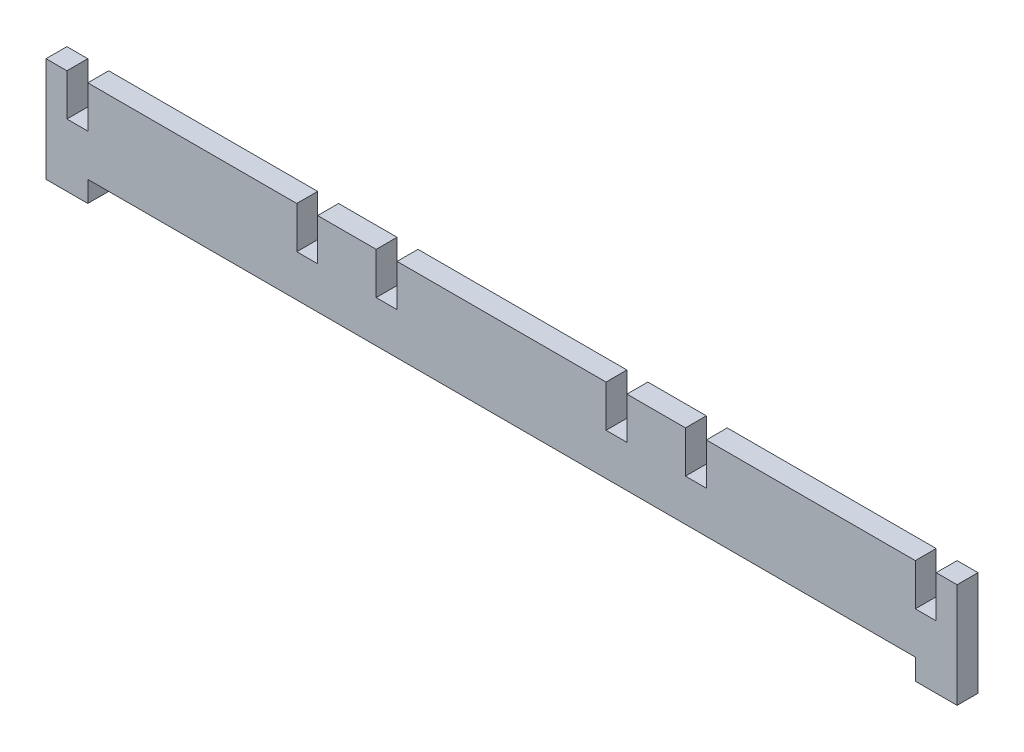
ISO-10303-21;
HEADER;
FILE_DESCRIPTION(('STEP AP214'),'2;1');
FILE_NAME('part.step','',(''),(''),'','','');
FILE_SCHEMA(('AUTOMOTIVE_DESIGN { 1 0 10303 214 1 1 1 1 }'));
ENDSEC;
DATA;
#1=APPLICATION_CONTEXT('core data for automotive mechanical design processes');
#2=APPLICATION_PROTOCOL_DEFINITION('international standard','automotive_design',2000,#1);
#3=PRODUCT_CONTEXT('',#1,'mechanical');
#4=PRODUCT('Part','Part','',(#3));
#5=PRODUCT_RELATED_PRODUCT_CATEGORY('part','',(#4));
#6=PRODUCT_DEFINITION_FORMATION('','',#4);
#7=PRODUCT_DEFINITION_CONTEXT('part definition',#1,'design');
#8=PRODUCT_DEFINITION('design','',#6,#7);
#9=PRODUCT_DEFINITION_SHAPE('','',#8);
#10=(LENGTH_UNIT() NAMED_UNIT(*) SI_UNIT(.MILLI.,.METRE.));
#11=(NAMED_UNIT(*) PLANE_ANGLE_UNIT() SI_UNIT($,.RADIAN.));
#12=(NAMED_UNIT(*) SI_UNIT($,.STERADIAN.) SOLID_ANGLE_UNIT());
#13=UNCERTAINTY_MEASURE_WITH_UNIT(LENGTH_MEASURE(1.E-05),#10,'distance_accuracy_value','');
#14=(GEOMETRIC_REPRESENTATION_CONTEXT(3) GLOBAL_UNCERTAINTY_ASSIGNED_CONTEXT((#13)) GLOBAL_UNIT_ASSIGNED_CONTEXT((#10,
#11,#12)) REPRESENTATION_CONTEXT('',''));
#15=CARTESIAN_POINT('',(0.,0.,0.));
#16=DIRECTION('',(0.,0.,1.));
#17=DIRECTION('',(1.,0.,0.));
#18=AXIS2_PLACEMENT_3D('',#15,#16,#17);
#19=CARTESIAN_POINT('',(-44.,-5.1679065461745E-13,5.));
#20=DIRECTION('',(0.,-1.,0.));
#21=DIRECTION('',(1.,0.,0.));
#22=AXIS2_PLACEMENT_3D('',#19,#20,#21);
#23=PLANE('',#22);
#24=DIRECTION('',(-1.,0.,0.));
#25=VECTOR('',#24,1.);
#26=CARTESIAN_POINT('',(-44.,-5.1679065461745E-13,0.));
#27=LINE('',#26,#25);
#28=CARTESIAN_POINT('',(-30.,0.,0.));
#29=VERTEX_POINT('',#28);
#30=CARTESIAN_POINT('',(-44.,-5.1679065461745E-13,0.));
#31=VERTEX_POINT('',#30);
#32=EDGE_CURVE('E279',#29,#31,#27,.T.);
#33=ORIENTED_EDGE('',*,*,#32,.T.);
#34=DIRECTION('',(0.,0.,-1.));
#35=VECTOR('',#34,1.);
#36=CARTESIAN_POINT('',(-44.,-5.1679065461745E-13,5.));
#37=LINE('',#36,#35);
#38=CARTESIAN_POINT('',(-44.,-5.1679065461745E-13,5.));
#39=VERTEX_POINT('',#38);
#40=EDGE_CURVE('E11',#39,#31,#37,.T.);
#41=ORIENTED_EDGE('',*,*,#40,.F.);
#42=DIRECTION('',(-1.,0.,0.));
#43=VECTOR('',#42,1.);
#44=CARTESIAN_POINT('',(-44.,-5.1679065461745E-13,5.));
#45=LINE('',#44,#43);
#46=CARTESIAN_POINT('',(-30.,0.,5.));
#47=VERTEX_POINT('',#46);
#48=EDGE_CURVE('E341',#47,#39,#45,.T.);
#49=ORIENTED_EDGE('',*,*,#48,.F.);
#50=DIRECTION('',(0.,0.,-1.));
#51=VECTOR('',#50,1.);
#52=CARTESIAN_POINT('',(-30.,0.,5.));
#53=LINE('',#52,#51);
#54=EDGE_CURVE('E275',#47,#29,#53,.T.);
#55=ORIENTED_EDGE('',*,*,#54,.T.);
#56=EDGE_LOOP('',(#33,#41,#49,#55));
#57=FACE_BOUND('',#56,.T.);
#58=ADVANCED_FACE('F39',(#57),#23,.F.);
#59=CARTESIAN_POINT('',(-44.,-5.1679065461745E-13,5.));
#60=DIRECTION('',(1.,0.,0.));
#61=DIRECTION('',(0.,0.,-1.));
#62=AXIS2_PLACEMENT_3D('',#59,#60,#61);
#63=PLANE('',#62);
#64=DIRECTION('',(0.,-1.,0.));
#65=VECTOR('',#64,1.);
#66=CARTESIAN_POINT('',(-44.,-5.1679065461745E-13,0.));
#67=LINE('',#66,#65);
#68=CARTESIAN_POINT('',(-44.,-10.0000000000005,0.));
#69=VERTEX_POINT('',#68);
#70=EDGE_CURVE('E282',#31,#69,#67,.T.);
#71=ORIENTED_EDGE('',*,*,#70,.T.);
#72=DIRECTION('',(0.,0.,-1.));
#73=VECTOR('',#72,1.);
#74=CARTESIAN_POINT('',(-44.,-10.0000000000005,5.));
#75=LINE('',#74,#73);
#76=CARTESIAN_POINT('',(-44.,-10.0000000000005,5.));
#77=VERTEX_POINT('',#76);
#78=EDGE_CURVE('E47',#77,#69,#75,.T.);
#79=ORIENTED_EDGE('',*,*,#78,.F.);
#80=DIRECTION('',(0.,-1.,0.));
#81=VECTOR('',#80,1.);
#82=CARTESIAN_POINT('',(-44.,-5.1679065461745E-13,5.));
#83=LINE('',#82,#81);
#84=EDGE_CURVE('E170',#39,#77,#83,.T.);
#85=ORIENTED_EDGE('',*,*,#84,.F.);
#86=ORIENTED_EDGE('',*,*,#40,.T.);
#87=EDGE_LOOP('',(#71,#79,#85,#86));
#88=FACE_BOUND('',#87,.T.);
#89=ADVANCED_FACE('F519',(#88),#63,.F.);
#90=CARTESIAN_POINT('',(-44.,-10.0000000000005,5.));
#91=DIRECTION('',(0.,-1.,0.));
#92=DIRECTION('',(0.,0.,-1.));
#93=AXIS2_PLACEMENT_3D('',#90,#91,#92);
#94=PLANE('',#93);
#95=DIRECTION('',(-1.,0.,0.));
#96=VECTOR('',#95,1.);
#97=CARTESIAN_POINT('',(-44.,-10.0000000000005,0.));
#98=LINE('',#97,#96);
#99=CARTESIAN_POINT('',(-49.,-10.0000000000005,0.));
#100=VERTEX_POINT('',#99);
#101=EDGE_CURVE('E284',#69,#100,#98,.T.);
#102=ORIENTED_EDGE('',*,*,#101,.T.);
#103=DIRECTION('',(0.,0.,-1.));
#104=VECTOR('',#103,1.);
#105=CARTESIAN_POINT('',(-49.,-10.0000000000005,5.));
#106=LINE('',#105,#104);
#107=CARTESIAN_POINT('',(-49.,-10.0000000000005,5.));
#108=VERTEX_POINT('',#107);
#109=EDGE_CURVE('E420',#108,#100,#106,.T.);
#110=ORIENTED_EDGE('',*,*,#109,.F.);
#111=DIRECTION('',(-1.,0.,0.));
#112=VECTOR('',#111,1.);
#113=CARTESIAN_POINT('',(-44.,-10.0000000000005,5.));
#114=LINE('',#113,#112);
#115=EDGE_CURVE('E428',#77,#108,#114,.T.);
#116=ORIENTED_EDGE('',*,*,#115,.F.);
#117=ORIENTED_EDGE('',*,*,#78,.T.);
#118=EDGE_LOOP('',(#102,#110,#116,#117));
#119=FACE_BOUND('',#118,.T.);
#120=ADVANCED_FACE('F426',(#119),#94,.F.);
#121=CARTESIAN_POINT('',(-49.,-10.0000000000005,5.));
#122=DIRECTION('',(-1.,0.,0.));
#123=DIRECTION('',(0.,-1.,0.));
#124=AXIS2_PLACEMENT_3D('',#121,#122,#123);
#125=PLANE('',#124);
#126=DIRECTION('',(0.,1.,0.));
#127=VECTOR('',#126,1.);
#128=CARTESIAN_POINT('',(-49.,-10.0000000000005,0.));
#129=LINE('',#128,#127);
#130=CARTESIAN_POINT('',(-49.,-5.10616004153047E-13,0.));
#131=VERTEX_POINT('',#130);
#132=EDGE_CURVE('E286',#100,#131,#129,.T.);
#133=ORIENTED_EDGE('',*,*,#132,.T.);
#134=DIRECTION('',(0.,0.,-1.));
#135=VECTOR('',#134,1.);
#136=CARTESIAN_POINT('',(-49.,-5.10616004153047E-13,5.));
#137=LINE('',#136,#135);
#138=CARTESIAN_POINT('',(-49.,-5.10616004153047E-13,5.));
#139=VERTEX_POINT('',#138);
#140=EDGE_CURVE('E417',#139,#131,#137,.T.);
#141=ORIENTED_EDGE('',*,*,#140,.F.);
#142=DIRECTION('',(0.,1.,0.));
#143=VECTOR('',#142,1.);
#144=CARTESIAN_POINT('',(-49.,-10.0000000000005,5.));
#145=LINE('',#144,#143);
#146=EDGE_CURVE('E446',#108,#139,#145,.T.);
#147=ORIENTED_EDGE('',*,*,#146,.F.);
#148=ORIENTED_EDGE('',*,*,#109,.T.);
#149=EDGE_LOOP('',(#133,#141,#147,#148));
#150=FACE_BOUND('',#149,.T.);
#151=ADVANCED_FACE('F437',(#150),#125,.F.);
#152=CARTESIAN_POINT('',(-99.,-5.16739238148784E-13,5.));
#153=DIRECTION('',(0.,-1.,0.));
#154=DIRECTION('',(1.,0.,0.));
#155=AXIS2_PLACEMENT_3D('',#152,#153,#154);
#156=PLANE('',#155);
#157=DIRECTION('',(-1.,0.,0.));
#158=VECTOR('',#157,1.);
#159=CARTESIAN_POINT('',(-99.,-5.16739238148784E-13,0.));
#160=LINE('',#159,#158);
#161=CARTESIAN_POINT('',(-99.,-5.16739238148784E-13,0.));
#162=VERTEX_POINT('',#161);
#163=EDGE_CURVE('E288',#131,#162,#160,.T.);
#164=ORIENTED_EDGE('',*,*,#163,.T.);
#165=DIRECTION('',(0.,0.,-1.));
#166=VECTOR('',#165,1.);
#167=CARTESIAN_POINT('',(-99.,-5.16739238148784E-13,5.));
#168=LINE('',#167,#166);
#169=CARTESIAN_POINT('',(-99.,-5.16739238148784E-13,5.));
#170=VERTEX_POINT('',#169);
#171=EDGE_CURVE('E414',#170,#162,#168,.T.);
#172=ORIENTED_EDGE('',*,*,#171,.F.);
#173=DIRECTION('',(-1.,0.,0.));
#174=VECTOR('',#173,1.);
#175=CARTESIAN_POINT('',(-99.,-5.16739238148784E-13,5.));
#176=LINE('',#175,#174);
#177=EDGE_CURVE('E443',#139,#170,#176,.T.);
#178=ORIENTED_EDGE('',*,*,#177,.F.);
#179=ORIENTED_EDGE('',*,*,#140,.T.);
#180=EDGE_LOOP('',(#164,#172,#178,#179));
#181=FACE_BOUND('',#180,.T.);
#182=ADVANCED_FACE('F441',(#181),#156,.F.);
#183=CARTESIAN_POINT('',(-99.,-10.0000000000005,5.));
#184=DIRECTION('',(1.,0.,0.));
#185=DIRECTION('',(0.,0.,-1.));
#186=AXIS2_PLACEMENT_3D('',#183,#184,#185);
#187=PLANE('',#186);
#188=DIRECTION('',(0.,-1.,0.));
#189=VECTOR('',#188,1.);
#190=CARTESIAN_POINT('',(-99.,-10.0000000000005,0.));
#191=LINE('',#190,#189);
#192=CARTESIAN_POINT('',(-99.,-10.0000000000005,0.));
#193=VERTEX_POINT('',#192);
#194=EDGE_CURVE('E290',#162,#193,#191,.T.);
#195=ORIENTED_EDGE('',*,*,#194,.T.);
#196=DIRECTION('',(0.,0.,-1.));
#197=VECTOR('',#196,1.);
#198=CARTESIAN_POINT('',(-99.,-10.0000000000005,5.));
#199=LINE('',#198,#197);
#200=CARTESIAN_POINT('',(-99.,-10.0000000000005,5.));
#201=VERTEX_POINT('',#200);
#202=EDGE_CURVE('E411',#201,#193,#199,.T.);
#203=ORIENTED_EDGE('',*,*,#202,.F.);
#204=DIRECTION('',(0.,-1.,0.));
#205=VECTOR('',#204,1.);
#206=CARTESIAN_POINT('',(-99.,-10.0000000000005,5.));
#207=LINE('',#206,#205);
#208=EDGE_CURVE('E445',#170,#201,#207,.T.);
#209=ORIENTED_EDGE('',*,*,#208,.F.);
#210=ORIENTED_EDGE('',*,*,#171,.T.);
#211=EDGE_LOOP('',(#195,#203,#209,#210));
#212=FACE_BOUND('',#211,.T.);
#213=ADVANCED_FACE('F532',(#212),#187,.F.);
#214=CARTESIAN_POINT('',(-104.,-10.0000000000005,5.));
#215=DIRECTION('',(0.,-1.,0.));
#216=DIRECTION('',(0.,0.,-1.));
#217=AXIS2_PLACEMENT_3D('',#214,#215,#216);
#218=PLANE('',#217);
#219=DIRECTION('',(-1.,0.,0.));
#220=VECTOR('',#219,1.);
#221=CARTESIAN_POINT('',(-104.,-10.0000000000005,0.));
#222=LINE('',#221,#220);
#223=CARTESIAN_POINT('',(-104.,-10.0000000000005,0.));
#224=VERTEX_POINT('',#223);
#225=EDGE_CURVE('E292',#193,#224,#222,.T.);
#226=ORIENTED_EDGE('',*,*,#225,.T.);
#227=DIRECTION('',(0.,0.,-1.));
#228=VECTOR('',#227,1.);
#229=CARTESIAN_POINT('',(-104.,-10.0000000000005,5.));
#230=LINE('',#229,#228);
#231=CARTESIAN_POINT('',(-104.,-10.0000000000005,5.));
#232=VERTEX_POINT('',#231);
#233=EDGE_CURVE('E408',#232,#224,#230,.T.);
#234=ORIENTED_EDGE('',*,*,#233,.F.);
#235=DIRECTION('',(-1.,0.,0.));
#236=VECTOR('',#235,1.);
#237=CARTESIAN_POINT('',(-104.,-10.0000000000005,5.));
#238=LINE('',#237,#236);
#239=EDGE_CURVE('E448',#201,#232,#238,.T.);
#240=ORIENTED_EDGE('',*,*,#239,.F.);
#241=ORIENTED_EDGE('',*,*,#202,.T.);
#242=EDGE_LOOP('',(#226,#234,#240,#241));
#243=FACE_BOUND('',#242,.T.);
#244=ADVANCED_FACE('F535',(#243),#218,.F.);
#245=CARTESIAN_POINT('',(-104.,0.,5.));
#246=DIRECTION('',(-1.,0.,0.));
#247=DIRECTION('',(0.,0.,1.));
#248=AXIS2_PLACEMENT_3D('',#245,#246,#247);
#249=PLANE('',#248);
#250=DIRECTION('',(0.,1.,0.));
#251=VECTOR('',#250,1.);
#252=CARTESIAN_POINT('',(-104.,0.,0.));
#253=LINE('',#252,#251);
#254=CARTESIAN_POINT('',(-104.,0.,0.));
#255=VERTEX_POINT('',#254);
#256=EDGE_CURVE('E294',#224,#255,#253,.T.);
#257=ORIENTED_EDGE('',*,*,#256,.T.);
#258=DIRECTION('',(0.,0.,-1.));
#259=VECTOR('',#258,1.);
#260=CARTESIAN_POINT('',(-104.,0.,5.));
#261=LINE('',#260,#259);
#262=CARTESIAN_POINT('',(-104.,0.,5.));
#263=VERTEX_POINT('',#262);
#264=EDGE_CURVE('E405',#263,#255,#261,.T.);
#265=ORIENTED_EDGE('',*,*,#264,.F.);
#266=DIRECTION('',(0.,1.,0.));
#267=VECTOR('',#266,1.);
#268=CARTESIAN_POINT('',(-104.,0.,5.));
#269=LINE('',#268,#267);
#270=EDGE_CURVE('E454',#232,#263,#269,.T.);
#271=ORIENTED_EDGE('',*,*,#270,.F.);
#272=ORIENTED_EDGE('',*,*,#233,.T.);
#273=EDGE_LOOP('',(#257,#265,#271,#272));
#274=FACE_BOUND('',#273,.T.);
#275=ADVANCED_FACE('F539',(#274),#249,.F.);
#276=CARTESIAN_POINT('',(-109.,0.,5.));
#277=DIRECTION('',(0.,-1.,0.));
#278=DIRECTION('',(0.,0.,-1.));
#279=AXIS2_PLACEMENT_3D('',#276,#277,#278);
#280=PLANE('',#279);
#281=DIRECTION('',(-1.,0.,0.));
#282=VECTOR('',#281,1.);
#283=CARTESIAN_POINT('',(-109.,0.,0.));
#284=LINE('',#283,#282);
#285=CARTESIAN_POINT('',(-109.,0.,0.));
#286=VERTEX_POINT('',#285);
#287=EDGE_CURVE('E296',#255,#286,#284,.T.);
#288=ORIENTED_EDGE('',*,*,#287,.T.);
#289=DIRECTION('',(0.,0.,-1.));
#290=VECTOR('',#289,1.);
#291=CARTESIAN_POINT('',(-109.,0.,5.));
#292=LINE('',#291,#290);
#293=CARTESIAN_POINT('',(-109.,0.,5.));
#294=VERTEX_POINT('',#293);
#295=EDGE_CURVE('E402',#294,#286,#292,.T.);
#296=ORIENTED_EDGE('',*,*,#295,.F.);
#297=DIRECTION('',(-1.,0.,0.));
#298=VECTOR('',#297,1.);
#299=CARTESIAN_POINT('',(-109.,0.,5.));
#300=LINE('',#299,#298);
#301=EDGE_CURVE('E456',#263,#294,#300,.T.);
#302=ORIENTED_EDGE('',*,*,#301,.F.);
#303=ORIENTED_EDGE('',*,*,#264,.T.);
#304=EDGE_LOOP('',(#288,#296,#302,#303));
#305=FACE_BOUND('',#304,.T.);
#306=ADVANCED_FACE('F543',(#305),#280,.F.);
#307=CARTESIAN_POINT('',(-109.,0.,5.));
#308=DIRECTION('',(1.,0.,0.));
#309=DIRECTION('',(0.,0.,-1.));
#310=AXIS2_PLACEMENT_3D('',#307,#308,#309);
#311=PLANE('',#310);
#312=DIRECTION('',(0.,-1.,0.));
#313=VECTOR('',#312,1.);
#314=CARTESIAN_POINT('',(-109.,0.,0.));
#315=LINE('',#314,#313);
#316=CARTESIAN_POINT('',(-109.,-25.,0.));
#317=VERTEX_POINT('',#316);
#318=EDGE_CURVE('E298',#286,#317,#315,.T.);
#319=ORIENTED_EDGE('',*,*,#318,.T.);
#320=DIRECTION('',(0.,0.,-1.));
#321=VECTOR('',#320,1.);
#322=CARTESIAN_POINT('',(-109.,-25.,5.));
#323=LINE('',#322,#321);
#324=CARTESIAN_POINT('',(-109.,-25.,5.));
#325=VERTEX_POINT('',#324);
#326=EDGE_CURVE('E399',#325,#317,#323,.T.);
#327=ORIENTED_EDGE('',*,*,#326,.F.);
#328=DIRECTION('',(0.,-1.,0.));
#329=VECTOR('',#328,1.);
#330=CARTESIAN_POINT('',(-109.,0.,5.));
#331=LINE('',#330,#329);
#332=EDGE_CURVE('E458',#294,#325,#331,.T.);
#333=ORIENTED_EDGE('',*,*,#332,.F.);
#334=ORIENTED_EDGE('',*,*,#295,.T.);
#335=EDGE_LOOP('',(#319,#327,#333,#334));
#336=FACE_BOUND('',#335,.T.);
#337=ADVANCED_FACE('F547',(#336),#311,.F.);
#338=CARTESIAN_POINT('',(-109.,-25.,5.));
#339=DIRECTION('',(0.,1.,0.));
#340=DIRECTION('',(-1.,0.,0.));
#341=AXIS2_PLACEMENT_3D('',#338,#339,#340);
#342=PLANE('',#341);
#343=DIRECTION('',(1.,0.,0.));
#344=VECTOR('',#343,1.);
#345=CARTESIAN_POINT('',(-109.,-25.,0.));
#346=LINE('',#345,#344);
#347=CARTESIAN_POINT('',(-99.,-25.,0.));
#348=VERTEX_POINT('',#347);
#349=EDGE_CURVE('E300',#317,#348,#346,.T.);
#350=ORIENTED_EDGE('',*,*,#349,.T.);
#351=DIRECTION('',(0.,0.,-1.));
#352=VECTOR('',#351,1.);
#353=CARTESIAN_POINT('',(-99.,-25.,5.));
#354=LINE('',#353,#352);
#355=CARTESIAN_POINT('',(-99.,-25.,5.));
#356=VERTEX_POINT('',#355);
#357=EDGE_CURVE('E396',#356,#348,#354,.T.);
#358=ORIENTED_EDGE('',*,*,#357,.F.);
#359=DIRECTION('',(1.,0.,0.));
#360=VECTOR('',#359,1.);
#361=CARTESIAN_POINT('',(-109.,-25.,5.));
#362=LINE('',#361,#360);
#363=EDGE_CURVE('E460',#325,#356,#362,.T.);
#364=ORIENTED_EDGE('',*,*,#363,.F.);
#365=ORIENTED_EDGE('',*,*,#326,.T.);
#366=EDGE_LOOP('',(#350,#358,#364,#365));
#367=FACE_BOUND('',#366,.T.);
#368=ADVANCED_FACE('F551',(#367),#342,.F.);
#369=CARTESIAN_POINT('',(-99.,-25.,5.));
#370=DIRECTION('',(-1.,0.,0.));
#371=DIRECTION('',(0.,-1.,0.));
#372=AXIS2_PLACEMENT_3D('',#369,#370,#371);
#373=PLANE('',#372);
#374=DIRECTION('',(0.,1.,0.));
#375=VECTOR('',#374,1.);
#376=CARTESIAN_POINT('',(-99.,-25.,0.));
#377=LINE('',#376,#375);
#378=CARTESIAN_POINT('',(-99.,-20.,0.));
#379=VERTEX_POINT('',#378);
#380=EDGE_CURVE('E302',#348,#379,#377,.T.);
#381=ORIENTED_EDGE('',*,*,#380,.T.);
#382=DIRECTION('',(0.,0.,-1.));
#383=VECTOR('',#382,1.);
#384=CARTESIAN_POINT('',(-99.,-20.,5.));
#385=LINE('',#384,#383);
#386=CARTESIAN_POINT('',(-99.,-20.,5.));
#387=VERTEX_POINT('',#386);
#388=EDGE_CURVE('E393',#387,#379,#385,.T.);
#389=ORIENTED_EDGE('',*,*,#388,.F.);
#390=DIRECTION('',(0.,1.,0.));
#391=VECTOR('',#390,1.);
#392=CARTESIAN_POINT('',(-99.,-25.,5.));
#393=LINE('',#392,#391);
#394=EDGE_CURVE('E462',#356,#387,#393,.T.);
#395=ORIENTED_EDGE('',*,*,#394,.F.);
#396=ORIENTED_EDGE('',*,*,#357,.T.);
#397=EDGE_LOOP('',(#381,#389,#395,#396));
#398=FACE_BOUND('',#397,.T.);
#399=ADVANCED_FACE('F555',(#398),#373,.F.);
#400=CARTESIAN_POINT('',(-99.,-20.,5.));
#401=DIRECTION('',(0.,1.,0.));
#402=DIRECTION('',(-1.,0.,0.));
#403=AXIS2_PLACEMENT_3D('',#400,#401,#402);
#404=PLANE('',#403);
#405=DIRECTION('',(1.,0.,0.));
#406=VECTOR('',#405,1.);
#407=CARTESIAN_POINT('',(-99.,-20.,0.));
#408=LINE('',#407,#406);
#409=CARTESIAN_POINT('',(99.,-20.,0.));
#410=VERTEX_POINT('',#409);
#411=EDGE_CURVE('E304',#379,#410,#408,.T.);
#412=ORIENTED_EDGE('',*,*,#411,.T.);
#413=DIRECTION('',(0.,0.,-1.));
#414=VECTOR('',#413,1.);
#415=CARTESIAN_POINT('',(99.,-20.,5.));
#416=LINE('',#415,#414);
#417=CARTESIAN_POINT('',(99.,-20.,5.));
#418=VERTEX_POINT('',#417);
#419=EDGE_CURVE('E390',#418,#410,#416,.T.);
#420=ORIENTED_EDGE('',*,*,#419,.F.);
#421=DIRECTION('',(1.,0.,0.));
#422=VECTOR('',#421,1.);
#423=CARTESIAN_POINT('',(-99.,-20.,5.));
#424=LINE('',#423,#422);
#425=EDGE_CURVE('E464',#387,#418,#424,.T.);
#426=ORIENTED_EDGE('',*,*,#425,.F.);
#427=ORIENTED_EDGE('',*,*,#388,.T.);
#428=EDGE_LOOP('',(#412,#420,#426,#427));
#429=FACE_BOUND('',#428,.T.);
#430=ADVANCED_FACE('F559',(#429),#404,.F.);
#431=CARTESIAN_POINT('',(99.,-25.,5.));
#432=DIRECTION('',(1.,0.,0.));
#433=DIRECTION('',(0.,1.,0.));
#434=AXIS2_PLACEMENT_3D('',#431,#432,#433);
#435=PLANE('',#434);
#436=DIRECTION('',(0.,-1.,0.));
#437=VECTOR('',#436,1.);
#438=CARTESIAN_POINT('',(99.,-25.,0.));
#439=LINE('',#438,#437);
#440=CARTESIAN_POINT('',(99.,-25.,0.));
#441=VERTEX_POINT('',#440);
#442=EDGE_CURVE('E306',#410,#441,#439,.T.);
#443=ORIENTED_EDGE('',*,*,#442,.T.);
#444=DIRECTION('',(0.,0.,-1.));
#445=VECTOR('',#444,1.);
#446=CARTESIAN_POINT('',(99.,-25.,5.));
#447=LINE('',#446,#445);
#448=CARTESIAN_POINT('',(99.,-25.,5.));
#449=VERTEX_POINT('',#448);
#450=EDGE_CURVE('E387',#449,#441,#447,.T.);
#451=ORIENTED_EDGE('',*,*,#450,.F.);
#452=DIRECTION('',(0.,-1.,0.));
#453=VECTOR('',#452,1.);
#454=CARTESIAN_POINT('',(99.,-25.,5.));
#455=LINE('',#454,#453);
#456=EDGE_CURVE('E466',#418,#449,#455,.T.);
#457=ORIENTED_EDGE('',*,*,#456,.F.);
#458=ORIENTED_EDGE('',*,*,#419,.T.);
#459=EDGE_LOOP('',(#443,#451,#457,#458));
#460=FACE_BOUND('',#459,.T.);
#461=ADVANCED_FACE('F563',(#460),#435,.F.);
#462=CARTESIAN_POINT('',(109.,-25.,5.));
#463=DIRECTION('',(0.,1.,0.));
#464=DIRECTION('',(0.,0.,1.));
#465=AXIS2_PLACEMENT_3D('',#462,#463,#464);
#466=PLANE('',#465);
#467=DIRECTION('',(1.,0.,0.));
#468=VECTOR('',#467,1.);
#469=CARTESIAN_POINT('',(109.,-25.,0.));
#470=LINE('',#469,#468);
#471=CARTESIAN_POINT('',(109.,-25.,0.));
#472=VERTEX_POINT('',#471);
#473=EDGE_CURVE('E308',#441,#472,#470,.T.);
#474=ORIENTED_EDGE('',*,*,#473,.T.);
#475=DIRECTION('',(0.,0.,-1.));
#476=VECTOR('',#475,1.);
#477=CARTESIAN_POINT('',(109.,-25.,5.));
#478=LINE('',#477,#476);
#479=CARTESIAN_POINT('',(109.,-25.,5.));
#480=VERTEX_POINT('',#479);
#481=EDGE_CURVE('E384',#480,#472,#478,.T.);
#482=ORIENTED_EDGE('',*,*,#481,.F.);
#483=DIRECTION('',(1.,0.,0.));
#484=VECTOR('',#483,1.);
#485=CARTESIAN_POINT('',(109.,-25.,5.));
#486=LINE('',#485,#484);
#487=EDGE_CURVE('E468',#449,#480,#486,.T.);
#488=ORIENTED_EDGE('',*,*,#487,.F.);
#489=ORIENTED_EDGE('',*,*,#450,.T.);
#490=EDGE_LOOP('',(#474,#482,#488,#489));
#491=FACE_BOUND('',#490,.T.);
#492=ADVANCED_FACE('F567',(#491),#466,.F.);
#493=CARTESIAN_POINT('',(109.,0.,5.));
#494=DIRECTION('',(-1.,0.,0.));
#495=DIRECTION('',(0.,0.,1.));
#496=AXIS2_PLACEMENT_3D('',#493,#494,#495);
#497=PLANE('',#496);
#498=DIRECTION('',(0.,1.,0.));
#499=VECTOR('',#498,1.);
#500=CARTESIAN_POINT('',(109.,0.,0.));
#501=LINE('',#500,#499);
#502=CARTESIAN_POINT('',(109.,0.,0.));
#503=VERTEX_POINT('',#502);
#504=EDGE_CURVE('E310',#472,#503,#501,.T.);
#505=ORIENTED_EDGE('',*,*,#504,.T.);
#506=DIRECTION('',(0.,0.,-1.));
#507=VECTOR('',#506,1.);
#508=CARTESIAN_POINT('',(109.,0.,5.));
#509=LINE('',#508,#507);
#510=CARTESIAN_POINT('',(109.,0.,5.));
#511=VERTEX_POINT('',#510);
#512=EDGE_CURVE('E381',#511,#503,#509,.T.);
#513=ORIENTED_EDGE('',*,*,#512,.F.);
#514=DIRECTION('',(0.,1.,0.));
#515=VECTOR('',#514,1.);
#516=CARTESIAN_POINT('',(109.,0.,5.));
#517=LINE('',#516,#515);
#518=EDGE_CURVE('E470',#480,#511,#517,.T.);
#519=ORIENTED_EDGE('',*,*,#518,.F.);
#520=ORIENTED_EDGE('',*,*,#481,.T.);
#521=EDGE_LOOP('',(#505,#513,#519,#520));
#522=FACE_BOUND('',#521,.T.);
#523=ADVANCED_FACE('F571',(#522),#497,.F.);
#524=CARTESIAN_POINT('',(104.,0.,5.));
#525=DIRECTION('',(0.,-1.,0.));
#526=DIRECTION('',(1.,0.,0.));
#527=AXIS2_PLACEMENT_3D('',#524,#525,#526);
#528=PLANE('',#527);
#529=DIRECTION('',(-1.,0.,0.));
#530=VECTOR('',#529,1.);
#531=CARTESIAN_POINT('',(104.,0.,0.));
#532=LINE('',#531,#530);
#533=CARTESIAN_POINT('',(104.,0.,0.));
#534=VERTEX_POINT('',#533);
#535=EDGE_CURVE('E312',#503,#534,#532,.T.);
#536=ORIENTED_EDGE('',*,*,#535,.T.);
#537=DIRECTION('',(0.,0.,-1.));
#538=VECTOR('',#537,1.);
#539=CARTESIAN_POINT('',(104.,0.,5.));
#540=LINE('',#539,#538);
#541=CARTESIAN_POINT('',(104.,0.,5.));
#542=VERTEX_POINT('',#541);
#543=EDGE_CURVE('E378',#542,#534,#540,.T.);
#544=ORIENTED_EDGE('',*,*,#543,.F.);
#545=DIRECTION('',(-1.,0.,0.));
#546=VECTOR('',#545,1.);
#547=CARTESIAN_POINT('',(104.,0.,5.));
#548=LINE('',#547,#546);
#549=EDGE_CURVE('E472',#511,#542,#548,.T.);
#550=ORIENTED_EDGE('',*,*,#549,.F.);
#551=ORIENTED_EDGE('',*,*,#512,.T.);
#552=EDGE_LOOP('',(#536,#544,#550,#551));
#553=FACE_BOUND('',#552,.T.);
#554=ADVANCED_FACE('F575',(#553),#528,.F.);
#555=CARTESIAN_POINT('',(104.,0.,5.));
#556=DIRECTION('',(1.,0.,0.));
#557=DIRECTION('',(0.,0.,-1.));
#558=AXIS2_PLACEMENT_3D('',#555,#556,#557);
#559=PLANE('',#558);
#560=DIRECTION('',(0.,-1.,0.));
#561=VECTOR('',#560,1.);
#562=CARTESIAN_POINT('',(104.,0.,0.));
#563=LINE('',#562,#561);
#564=CARTESIAN_POINT('',(104.,-9.99999999999999,0.));
#565=VERTEX_POINT('',#564);
#566=EDGE_CURVE('E314',#534,#565,#563,.T.);
#567=ORIENTED_EDGE('',*,*,#566,.T.);
#568=DIRECTION('',(0.,0.,-1.));
#569=VECTOR('',#568,1.);
#570=CARTESIAN_POINT('',(104.,-9.99999999999999,5.));
#571=LINE('',#570,#569);
#572=CARTESIAN_POINT('',(104.,-9.99999999999999,5.));
#573=VERTEX_POINT('',#572);
#574=EDGE_CURVE('E375',#573,#565,#571,.T.);
#575=ORIENTED_EDGE('',*,*,#574,.F.);
#576=DIRECTION('',(0.,-1.,0.));
#577=VECTOR('',#576,1.);
#578=CARTESIAN_POINT('',(104.,0.,5.));
#579=LINE('',#578,#577);
#580=EDGE_CURVE('E474',#542,#573,#579,.T.);
#581=ORIENTED_EDGE('',*,*,#580,.F.);
#582=ORIENTED_EDGE('',*,*,#543,.T.);
#583=EDGE_LOOP('',(#567,#575,#581,#582));
#584=FACE_BOUND('',#583,.T.);
#585=ADVANCED_FACE('F579',(#584),#559,.F.);
#586=CARTESIAN_POINT('',(104.,-9.99999999999999,5.));
#587=DIRECTION('',(0.,-1.,0.));
#588=DIRECTION('',(0.,0.,-1.));
#589=AXIS2_PLACEMENT_3D('',#586,#587,#588);
#590=PLANE('',#589);
#591=DIRECTION('',(-1.,0.,0.));
#592=VECTOR('',#591,1.);
#593=CARTESIAN_POINT('',(104.,-9.99999999999999,0.));
#594=LINE('',#593,#592);
#595=CARTESIAN_POINT('',(99.,-9.99999999999999,0.));
#596=VERTEX_POINT('',#595);
#597=EDGE_CURVE('E316',#565,#596,#594,.T.);
#598=ORIENTED_EDGE('',*,*,#597,.T.);
#599=DIRECTION('',(0.,0.,-1.));
#600=VECTOR('',#599,1.);
#601=CARTESIAN_POINT('',(99.,-9.99999999999999,5.));
#602=LINE('',#601,#600);
#603=CARTESIAN_POINT('',(99.,-9.99999999999999,5.));
#604=VERTEX_POINT('',#603);
#605=EDGE_CURVE('E372',#604,#596,#602,.T.);
#606=ORIENTED_EDGE('',*,*,#605,.F.);
#607=DIRECTION('',(-1.,0.,0.));
#608=VECTOR('',#607,1.);
#609=CARTESIAN_POINT('',(104.,-9.99999999999999,5.));
#610=LINE('',#609,#608);
#611=EDGE_CURVE('E476',#573,#604,#610,.T.);
#612=ORIENTED_EDGE('',*,*,#611,.F.);
#613=ORIENTED_EDGE('',*,*,#574,.T.);
#614=EDGE_LOOP('',(#598,#606,#612,#613));
#615=FACE_BOUND('',#614,.T.);
#616=ADVANCED_FACE('F583',(#615),#590,.F.);
#617=CARTESIAN_POINT('',(99.,-9.99999999999999,5.));
#618=DIRECTION('',(-1.,0.,0.));
#619=DIRECTION('',(0.,0.,1.));
#620=AXIS2_PLACEMENT_3D('',#617,#618,#619);
#621=PLANE('',#620);
#622=DIRECTION('',(0.,1.,0.));
#623=VECTOR('',#622,1.);
#624=CARTESIAN_POINT('',(99.,-9.99999999999999,0.));
#625=LINE('',#624,#623);
#626=CARTESIAN_POINT('',(99.,0.,0.));
#627=VERTEX_POINT('',#626);
#628=EDGE_CURVE('E318',#596,#627,#625,.T.);
#629=ORIENTED_EDGE('',*,*,#628,.T.);
#630=DIRECTION('',(0.,0.,-1.));
#631=VECTOR('',#630,1.);
#632=CARTESIAN_POINT('',(99.,0.,5.));
#633=LINE('',#632,#631);
#634=CARTESIAN_POINT('',(99.,0.,5.));
#635=VERTEX_POINT('',#634);
#636=EDGE_CURVE('E369',#635,#627,#633,.T.);
#637=ORIENTED_EDGE('',*,*,#636,.F.);
#638=DIRECTION('',(0.,1.,0.));
#639=VECTOR('',#638,1.);
#640=CARTESIAN_POINT('',(99.,-9.99999999999999,5.));
#641=LINE('',#640,#639);
#642=EDGE_CURVE('E478',#604,#635,#641,.T.);
#643=ORIENTED_EDGE('',*,*,#642,.F.);
#644=ORIENTED_EDGE('',*,*,#605,.T.);
#645=EDGE_LOOP('',(#629,#637,#643,#644));
#646=FACE_BOUND('',#645,.T.);
#647=ADVANCED_FACE('F587',(#646),#621,.F.);
#648=CARTESIAN_POINT('',(49.,0.,5.));
#649=DIRECTION('',(0.,-1.,0.));
#650=DIRECTION('',(1.,0.,0.));
#651=AXIS2_PLACEMENT_3D('',#648,#649,#650);
#652=PLANE('',#651);
#653=DIRECTION('',(-1.,0.,0.));
#654=VECTOR('',#653,1.);
#655=CARTESIAN_POINT('',(49.,0.,0.));
#656=LINE('',#655,#654);
#657=CARTESIAN_POINT('',(49.,0.,0.));
#658=VERTEX_POINT('',#657);
#659=EDGE_CURVE('E320',#627,#658,#656,.T.);
#660=ORIENTED_EDGE('',*,*,#659,.T.);
#661=DIRECTION('',(0.,0.,-1.));
#662=VECTOR('',#661,1.);
#663=CARTESIAN_POINT('',(49.,0.,5.));
#664=LINE('',#663,#662);
#665=CARTESIAN_POINT('',(49.,0.,5.));
#666=VERTEX_POINT('',#665);
#667=EDGE_CURVE('E366',#666,#658,#664,.T.);
#668=ORIENTED_EDGE('',*,*,#667,.F.);
#669=DIRECTION('',(-1.,0.,0.));
#670=VECTOR('',#669,1.);
#671=CARTESIAN_POINT('',(49.,0.,5.));
#672=LINE('',#671,#670);
#673=EDGE_CURVE('E480',#635,#666,#672,.T.);
#674=ORIENTED_EDGE('',*,*,#673,.F.);
#675=ORIENTED_EDGE('',*,*,#636,.T.);
#676=EDGE_LOOP('',(#660,#668,#674,#675));
#677=FACE_BOUND('',#676,.T.);
#678=ADVANCED_FACE('F591',(#677),#652,.F.);
#679=CARTESIAN_POINT('',(49.,-10.,5.));
#680=DIRECTION('',(1.,0.,0.));
#681=DIRECTION('',(0.,1.,0.));
#682=AXIS2_PLACEMENT_3D('',#679,#680,#681);
#683=PLANE('',#682);
#684=DIRECTION('',(0.,-1.,0.));
#685=VECTOR('',#684,1.);
#686=CARTESIAN_POINT('',(49.,-10.,0.));
#687=LINE('',#686,#685);
#688=CARTESIAN_POINT('',(49.,-10.,0.));
#689=VERTEX_POINT('',#688);
#690=EDGE_CURVE('E322',#658,#689,#687,.T.);
#691=ORIENTED_EDGE('',*,*,#690,.T.);
#692=DIRECTION('',(0.,0.,-1.));
#693=VECTOR('',#692,1.);
#694=CARTESIAN_POINT('',(49.,-10.,5.));
#695=LINE('',#694,#693);
#696=CARTESIAN_POINT('',(49.,-10.,5.));
#697=VERTEX_POINT('',#696);
#698=EDGE_CURVE('E363',#697,#689,#695,.T.);
#699=ORIENTED_EDGE('',*,*,#698,.F.);
#700=DIRECTION('',(0.,-1.,0.));
#701=VECTOR('',#700,1.);
#702=CARTESIAN_POINT('',(49.,-10.,5.));
#703=LINE('',#702,#701);
#704=EDGE_CURVE('E482',#666,#697,#703,.T.);
#705=ORIENTED_EDGE('',*,*,#704,.F.);
#706=ORIENTED_EDGE('',*,*,#667,.T.);
#707=EDGE_LOOP('',(#691,#699,#705,#706));
#708=FACE_BOUND('',#707,.T.);
#709=ADVANCED_FACE('F595',(#708),#683,.F.);
#710=CARTESIAN_POINT('',(44.,-10.,5.));
#711=DIRECTION('',(0.,-1.,0.));
#712=DIRECTION('',(0.,0.,-1.));
#713=AXIS2_PLACEMENT_3D('',#710,#711,#712);
#714=PLANE('',#713);
#715=DIRECTION('',(-1.,0.,0.));
#716=VECTOR('',#715,1.);
#717=CARTESIAN_POINT('',(44.,-10.,0.));
#718=LINE('',#717,#716);
#719=CARTESIAN_POINT('',(44.,-10.,0.));
#720=VERTEX_POINT('',#719);
#721=EDGE_CURVE('E324',#689,#720,#718,.T.);
#722=ORIENTED_EDGE('',*,*,#721,.T.);
#723=DIRECTION('',(0.,0.,-1.));
#724=VECTOR('',#723,1.);
#725=CARTESIAN_POINT('',(44.,-10.,5.));
#726=LINE('',#725,#724);
#727=CARTESIAN_POINT('',(44.,-10.,5.));
#728=VERTEX_POINT('',#727);
#729=EDGE_CURVE('E360',#728,#720,#726,.T.);
#730=ORIENTED_EDGE('',*,*,#729,.F.);
#731=DIRECTION('',(-1.,0.,0.));
#732=VECTOR('',#731,1.);
#733=CARTESIAN_POINT('',(44.,-10.,5.));
#734=LINE('',#733,#732);
#735=EDGE_CURVE('E484',#697,#728,#734,.T.);
#736=ORIENTED_EDGE('',*,*,#735,.F.);
#737=ORIENTED_EDGE('',*,*,#698,.T.);
#738=EDGE_LOOP('',(#722,#730,#736,#737));
#739=FACE_BOUND('',#738,.T.);
#740=ADVANCED_FACE('F599',(#739),#714,.F.);
#741=CARTESIAN_POINT('',(44.,5.16739238148784E-13,5.));
#742=DIRECTION('',(-1.,0.,0.));
#743=DIRECTION('',(0.,0.,1.));
#744=AXIS2_PLACEMENT_3D('',#741,#742,#743);
#745=PLANE('',#744);
#746=DIRECTION('',(0.,1.,0.));
#747=VECTOR('',#746,1.);
#748=CARTESIAN_POINT('',(44.,5.16739238148784E-13,0.));
#749=LINE('',#748,#747);
#750=CARTESIAN_POINT('',(44.,5.16739238148784E-13,0.));
#751=VERTEX_POINT('',#750);
#752=EDGE_CURVE('E326',#720,#751,#749,.T.);
#753=ORIENTED_EDGE('',*,*,#752,.T.);
#754=DIRECTION('',(0.,0.,-1.));
#755=VECTOR('',#754,1.);
#756=CARTESIAN_POINT('',(44.,5.16739238148784E-13,5.));
#757=LINE('',#756,#755);
#758=CARTESIAN_POINT('',(44.,5.16739238148784E-13,5.));
#759=VERTEX_POINT('',#758);
#760=EDGE_CURVE('E357',#759,#751,#757,.T.);
#761=ORIENTED_EDGE('',*,*,#760,.F.);
#762=DIRECTION('',(0.,1.,0.));
#763=VECTOR('',#762,1.);
#764=CARTESIAN_POINT('',(44.,5.16739238148784E-13,5.));
#765=LINE('',#764,#763);
#766=EDGE_CURVE('E486',#728,#759,#765,.T.);
#767=ORIENTED_EDGE('',*,*,#766,.F.);
#768=ORIENTED_EDGE('',*,*,#729,.T.);
#769=EDGE_LOOP('',(#753,#761,#767,#768));
#770=FACE_BOUND('',#769,.T.);
#771=ADVANCED_FACE('F603',(#770),#745,.F.);
#772=CARTESIAN_POINT('',(30.,0.,5.));
#773=DIRECTION('',(0.,-1.,0.));
#774=DIRECTION('',(1.,0.,0.));
#775=AXIS2_PLACEMENT_3D('',#772,#773,#774);
#776=PLANE('',#775);
#777=DIRECTION('',(-1.,0.,0.));
#778=VECTOR('',#777,1.);
#779=CARTESIAN_POINT('',(30.,0.,0.));
#780=LINE('',#779,#778);
#781=CARTESIAN_POINT('',(30.,0.,0.));
#782=VERTEX_POINT('',#781);
#783=EDGE_CURVE('E328',#751,#782,#780,.T.);
#784=ORIENTED_EDGE('',*,*,#783,.T.);
#785=DIRECTION('',(0.,0.,-1.));
#786=VECTOR('',#785,1.);
#787=CARTESIAN_POINT('',(30.,0.,5.));
#788=LINE('',#787,#786);
#789=CARTESIAN_POINT('',(30.,0.,5.));
#790=VERTEX_POINT('',#789);
#791=EDGE_CURVE('E354',#790,#782,#788,.T.);
#792=ORIENTED_EDGE('',*,*,#791,.F.);
#793=DIRECTION('',(-1.,0.,0.));
#794=VECTOR('',#793,1.);
#795=CARTESIAN_POINT('',(30.,0.,5.));
#796=LINE('',#795,#794);
#797=EDGE_CURVE('E488',#759,#790,#796,.T.);
#798=ORIENTED_EDGE('',*,*,#797,.F.);
#799=ORIENTED_EDGE('',*,*,#760,.T.);
#800=EDGE_LOOP('',(#784,#792,#798,#799));
#801=FACE_BOUND('',#800,.T.);
#802=ADVANCED_FACE('F607',(#801),#776,.F.);
#803=CARTESIAN_POINT('',(30.,0.,5.));
#804=DIRECTION('',(1.,0.,0.));
#805=DIRECTION('',(0.,0.,-1.));
#806=AXIS2_PLACEMENT_3D('',#803,#804,#805);
#807=PLANE('',#806);
#808=DIRECTION('',(0.,-1.,0.));
#809=VECTOR('',#808,1.);
#810=CARTESIAN_POINT('',(30.,0.,0.));
#811=LINE('',#810,#809);
#812=CARTESIAN_POINT('',(30.,-10.,0.));
#813=VERTEX_POINT('',#812);
#814=EDGE_CURVE('E330',#782,#813,#811,.T.);
#815=ORIENTED_EDGE('',*,*,#814,.T.);
#816=DIRECTION('',(0.,0.,-1.));
#817=VECTOR('',#816,1.);
#818=CARTESIAN_POINT('',(30.,-10.,5.));
#819=LINE('',#818,#817);
#820=CARTESIAN_POINT('',(30.,-10.,5.));
#821=VERTEX_POINT('',#820);
#822=EDGE_CURVE('E351',#821,#813,#819,.T.);
#823=ORIENTED_EDGE('',*,*,#822,.F.);
#824=DIRECTION('',(0.,-1.,0.));
#825=VECTOR('',#824,1.);
#826=CARTESIAN_POINT('',(30.,0.,5.));
#827=LINE('',#826,#825);
#828=EDGE_CURVE('E490',#790,#821,#827,.T.);
#829=ORIENTED_EDGE('',*,*,#828,.F.);
#830=ORIENTED_EDGE('',*,*,#791,.T.);
#831=EDGE_LOOP('',(#815,#823,#829,#830));
#832=FACE_BOUND('',#831,.T.);
#833=ADVANCED_FACE('F611',(#832),#807,.F.);
#834=CARTESIAN_POINT('',(30.,-10.,5.));
#835=DIRECTION('',(0.,-1.,0.));
#836=DIRECTION('',(0.,0.,-1.));
#837=AXIS2_PLACEMENT_3D('',#834,#835,#836);
#838=PLANE('',#837);
#839=DIRECTION('',(-1.,0.,0.));
#840=VECTOR('',#839,1.);
#841=CARTESIAN_POINT('',(30.,-10.,0.));
#842=LINE('',#841,#840);
#843=CARTESIAN_POINT('',(25.,-10.,0.));
#844=VERTEX_POINT('',#843);
#845=EDGE_CURVE('E332',#813,#844,#842,.T.);
#846=ORIENTED_EDGE('',*,*,#845,.T.);
#847=DIRECTION('',(0.,0.,-1.));
#848=VECTOR('',#847,1.);
#849=CARTESIAN_POINT('',(25.,-10.,5.));
#850=LINE('',#849,#848);
#851=CARTESIAN_POINT('',(25.,-10.,5.));
#852=VERTEX_POINT('',#851);
#853=EDGE_CURVE('E348',#852,#844,#850,.T.);
#854=ORIENTED_EDGE('',*,*,#853,.F.);
#855=DIRECTION('',(-1.,0.,0.));
#856=VECTOR('',#855,1.);
#857=CARTESIAN_POINT('',(30.,-10.,5.));
#858=LINE('',#857,#856);
#859=EDGE_CURVE('E492',#821,#852,#858,.T.);
#860=ORIENTED_EDGE('',*,*,#859,.F.);
#861=ORIENTED_EDGE('',*,*,#822,.T.);
#862=EDGE_LOOP('',(#846,#854,#860,#861));
#863=FACE_BOUND('',#862,.T.);
#864=ADVANCED_FACE('F615',(#863),#838,.F.);
#865=CARTESIAN_POINT('',(25.,-10.,5.));
#866=DIRECTION('',(-1.,0.,0.));
#867=DIRECTION('',(0.,0.,1.));
#868=AXIS2_PLACEMENT_3D('',#865,#866,#867);
#869=PLANE('',#868);
#870=DIRECTION('',(0.,1.,0.));
#871=VECTOR('',#870,1.);
#872=CARTESIAN_POINT('',(25.,-10.,0.));
#873=LINE('',#872,#871);
#874=CARTESIAN_POINT('',(25.,0.,0.));
#875=VERTEX_POINT('',#874);
#876=EDGE_CURVE('E334',#844,#875,#873,.T.);
#877=ORIENTED_EDGE('',*,*,#876,.T.);
#878=DIRECTION('',(0.,0.,-1.));
#879=VECTOR('',#878,1.);
#880=CARTESIAN_POINT('',(25.,0.,5.));
#881=LINE('',#880,#879);
#882=CARTESIAN_POINT('',(25.,0.,5.));
#883=VERTEX_POINT('',#882);
#884=EDGE_CURVE('E345',#883,#875,#881,.T.);
#885=ORIENTED_EDGE('',*,*,#884,.F.);
#886=DIRECTION('',(0.,1.,0.));
#887=VECTOR('',#886,1.);
#888=CARTESIAN_POINT('',(25.,-10.,5.));
#889=LINE('',#888,#887);
#890=EDGE_CURVE('E494',#852,#883,#889,.T.);
#891=ORIENTED_EDGE('',*,*,#890,.F.);
#892=ORIENTED_EDGE('',*,*,#853,.T.);
#893=EDGE_LOOP('',(#877,#885,#891,#892));
#894=FACE_BOUND('',#893,.T.);
#895=ADVANCED_FACE('F500',(#894),#869,.F.);
#896=CARTESIAN_POINT('',(-25.,0.,5.));
#897=DIRECTION('',(0.,-1.,0.));
#898=DIRECTION('',(0.,0.,-1.));
#899=AXIS2_PLACEMENT_3D('',#896,#897,#898);
#900=PLANE('',#899);
#901=DIRECTION('',(-1.,0.,0.));
#902=VECTOR('',#901,1.);
#903=CARTESIAN_POINT('',(-25.,0.,0.));
#904=LINE('',#903,#902);
#905=CARTESIAN_POINT('',(-25.,0.,0.));
#906=VERTEX_POINT('',#905);
#907=EDGE_CURVE('E336',#875,#906,#904,.T.);
#908=ORIENTED_EDGE('',*,*,#907,.T.);
#909=DIRECTION('',(0.,0.,-1.));
#910=VECTOR('',#909,1.);
#911=CARTESIAN_POINT('',(-25.,0.,5.));
#912=LINE('',#911,#910);
#913=CARTESIAN_POINT('',(-25.,0.,5.));
#914=VERTEX_POINT('',#913);
#915=EDGE_CURVE('E270',#914,#906,#912,.T.);
#916=ORIENTED_EDGE('',*,*,#915,.F.);
#917=DIRECTION('',(-1.,0.,0.));
#918=VECTOR('',#917,1.);
#919=CARTESIAN_POINT('',(-25.,0.,5.));
#920=LINE('',#919,#918);
#921=EDGE_CURVE('E261',#883,#914,#920,.T.);
#922=ORIENTED_EDGE('',*,*,#921,.F.);
#923=ORIENTED_EDGE('',*,*,#884,.T.);
#924=EDGE_LOOP('',(#908,#916,#922,#923));
#925=FACE_BOUND('',#924,.T.);
#926=ADVANCED_FACE('F504',(#925),#900,.F.);
#927=CARTESIAN_POINT('',(-25.,-10.,5.));
#928=DIRECTION('',(1.,0.,0.));
#929=DIRECTION('',(0.,0.,-1.));
#930=AXIS2_PLACEMENT_3D('',#927,#928,#929);
#931=PLANE('',#930);
#932=DIRECTION('',(0.,-1.,0.));
#933=VECTOR('',#932,1.);
#934=CARTESIAN_POINT('',(-25.,-10.,0.));
#935=LINE('',#934,#933);
#936=CARTESIAN_POINT('',(-25.,-10.,0.));
#937=VERTEX_POINT('',#936);
#938=EDGE_CURVE('E269',#906,#937,#935,.T.);
#939=ORIENTED_EDGE('',*,*,#938,.T.);
#940=DIRECTION('',(0.,0.,-1.));
#941=VECTOR('',#940,1.);
#942=CARTESIAN_POINT('',(-25.,-10.,5.));
#943=LINE('',#942,#941);
#944=CARTESIAN_POINT('',(-25.,-10.,5.));
#945=VERTEX_POINT('',#944);
#946=EDGE_CURVE('E266',#945,#937,#943,.T.);
#947=ORIENTED_EDGE('',*,*,#946,.F.);
#948=DIRECTION('',(0.,-1.,0.));
#949=VECTOR('',#948,1.);
#950=CARTESIAN_POINT('',(-25.,-10.,5.));
#951=LINE('',#950,#949);
#952=EDGE_CURVE('E255',#914,#945,#951,.T.);
#953=ORIENTED_EDGE('',*,*,#952,.F.);
#954=ORIENTED_EDGE('',*,*,#915,.T.);
#955=EDGE_LOOP('',(#939,#947,#953,#954));
#956=FACE_BOUND('',#955,.T.);
#957=ADVANCED_FACE('F267',(#956),#931,.F.);
#958=CARTESIAN_POINT('',(-30.,-10.,5.));
#959=DIRECTION('',(0.,-1.,0.));
#960=DIRECTION('',(0.,0.,-1.));
#961=AXIS2_PLACEMENT_3D('',#958,#959,#960);
#962=PLANE('',#961);
#963=DIRECTION('',(-1.,0.,0.));
#964=VECTOR('',#963,1.);
#965=CARTESIAN_POINT('',(-30.,-10.,0.));
#966=LINE('',#965,#964);
#967=CARTESIAN_POINT('',(-30.,-10.,0.));
#968=VERTEX_POINT('',#967);
#969=EDGE_CURVE('E156',#937,#968,#966,.T.);
#970=ORIENTED_EDGE('',*,*,#969,.T.);
#971=DIRECTION('',(0.,0.,-1.));
#972=VECTOR('',#971,1.);
#973=CARTESIAN_POINT('',(-30.,-10.,5.));
#974=LINE('',#973,#972);
#975=CARTESIAN_POINT('',(-30.,-10.,5.));
#976=VERTEX_POINT('',#975);
#977=EDGE_CURVE('E271',#976,#968,#974,.T.);
#978=ORIENTED_EDGE('',*,*,#977,.F.);
#979=DIRECTION('',(-1.,0.,0.));
#980=VECTOR('',#979,1.);
#981=CARTESIAN_POINT('',(-30.,-10.,5.));
#982=LINE('',#981,#980);
#983=EDGE_CURVE('E259',#945,#976,#982,.T.);
#984=ORIENTED_EDGE('',*,*,#983,.F.);
#985=ORIENTED_EDGE('',*,*,#946,.T.);
#986=EDGE_LOOP('',(#970,#978,#984,#985));
#987=FACE_BOUND('',#986,.T.);
#988=ADVANCED_FACE('F273',(#987),#962,.F.);
#989=CARTESIAN_POINT('',(-30.,0.,5.));
#990=DIRECTION('',(-1.,0.,0.));
#991=DIRECTION('',(0.,0.,1.));
#992=AXIS2_PLACEMENT_3D('',#989,#990,#991);
#993=PLANE('',#992);
#994=DIRECTION('',(0.,1.,0.));
#995=VECTOR('',#994,1.);
#996=CARTESIAN_POINT('',(-30.,0.,0.));
#997=LINE('',#996,#995);
#998=EDGE_CURVE('E162',#968,#29,#997,.T.);
#999=ORIENTED_EDGE('',*,*,#998,.T.);
#1000=ORIENTED_EDGE('',*,*,#54,.F.);
#1001=DIRECTION('',(0.,1.,0.));
#1002=VECTOR('',#1001,1.);
#1003=CARTESIAN_POINT('',(-30.,0.,5.));
#1004=LINE('',#1003,#1002);
#1005=EDGE_CURVE('E55',#976,#47,#1004,.T.);
#1006=ORIENTED_EDGE('',*,*,#1005,.F.);
#1007=ORIENTED_EDGE('',*,*,#977,.T.);
#1008=EDGE_LOOP('',(#999,#1000,#1006,#1007));
#1009=FACE_BOUND('',#1008,.T.);
#1010=ADVANCED_FACE('F508',(#1009),#993,.F.);
#1011=CARTESIAN_POINT('',(0.,0.,5.));
#1012=DIRECTION('',(0.,0.,-1.));
#1013=DIRECTION('',(-1.,0.,0.));
#1014=AXIS2_PLACEMENT_3D('',#1011,#1012,#1013);
#1015=PLANE('',#1014);
#1016=ORIENTED_EDGE('',*,*,#48,.T.);
#1017=ORIENTED_EDGE('',*,*,#84,.T.);
#1018=ORIENTED_EDGE('',*,*,#115,.T.);
#1019=ORIENTED_EDGE('',*,*,#146,.T.);
#1020=ORIENTED_EDGE('',*,*,#177,.T.);
#1021=ORIENTED_EDGE('',*,*,#208,.T.);
#1022=ORIENTED_EDGE('',*,*,#239,.T.);
#1023=ORIENTED_EDGE('',*,*,#270,.T.);
#1024=ORIENTED_EDGE('',*,*,#301,.T.);
#1025=ORIENTED_EDGE('',*,*,#332,.T.);
#1026=ORIENTED_EDGE('',*,*,#363,.T.);
#1027=ORIENTED_EDGE('',*,*,#394,.T.);
#1028=ORIENTED_EDGE('',*,*,#425,.T.);
#1029=ORIENTED_EDGE('',*,*,#456,.T.);
#1030=ORIENTED_EDGE('',*,*,#487,.T.);
#1031=ORIENTED_EDGE('',*,*,#518,.T.);
#1032=ORIENTED_EDGE('',*,*,#549,.T.);
#1033=ORIENTED_EDGE('',*,*,#580,.T.);
#1034=ORIENTED_EDGE('',*,*,#611,.T.);
#1035=ORIENTED_EDGE('',*,*,#642,.T.);
#1036=ORIENTED_EDGE('',*,*,#673,.T.);
#1037=ORIENTED_EDGE('',*,*,#704,.T.);
#1038=ORIENTED_EDGE('',*,*,#735,.T.);
#1039=ORIENTED_EDGE('',*,*,#766,.T.);
#1040=ORIENTED_EDGE('',*,*,#797,.T.);
#1041=ORIENTED_EDGE('',*,*,#828,.T.);
#1042=ORIENTED_EDGE('',*,*,#859,.T.);
#1043=ORIENTED_EDGE('',*,*,#890,.T.);
#1044=ORIENTED_EDGE('',*,*,#921,.T.);
#1045=ORIENTED_EDGE('',*,*,#952,.T.);
#1046=ORIENTED_EDGE('',*,*,#983,.T.);
#1047=ORIENTED_EDGE('',*,*,#1005,.T.);
#1048=EDGE_LOOP('',(#1016,#1017,#1018,#1019,#1020,#1021,#1022,#1023,#1024,#1025,#1026,#1027,
#1028,#1029,#1030,#1031,#1032,#1033,#1034,#1035,#1036,#1037,#1038,#1039,#1040,#1041,#1042,#1043,
#1044,#1045,#1046,#1047));
#1049=FACE_BOUND('',#1048,.T.);
#1050=ADVANCED_FACE('F257',(#1049),#1015,.F.);
#1051=CARTESIAN_POINT('',(0.,0.,0.));
#1052=DIRECTION('',(0.,0.,-1.));
#1053=DIRECTION('',(-1.,0.,0.));
#1054=AXIS2_PLACEMENT_3D('',#1051,#1052,#1053);
#1055=PLANE('',#1054);
#1056=ORIENTED_EDGE('',*,*,#32,.F.);
#1057=ORIENTED_EDGE('',*,*,#998,.F.);
#1058=ORIENTED_EDGE('',*,*,#969,.F.);
#1059=ORIENTED_EDGE('',*,*,#938,.F.);
#1060=ORIENTED_EDGE('',*,*,#907,.F.);
#1061=ORIENTED_EDGE('',*,*,#876,.F.);
#1062=ORIENTED_EDGE('',*,*,#845,.F.);
#1063=ORIENTED_EDGE('',*,*,#814,.F.);
#1064=ORIENTED_EDGE('',*,*,#783,.F.);
#1065=ORIENTED_EDGE('',*,*,#752,.F.);
#1066=ORIENTED_EDGE('',*,*,#721,.F.);
#1067=ORIENTED_EDGE('',*,*,#690,.F.);
#1068=ORIENTED_EDGE('',*,*,#659,.F.);
#1069=ORIENTED_EDGE('',*,*,#628,.F.);
#1070=ORIENTED_EDGE('',*,*,#597,.F.);
#1071=ORIENTED_EDGE('',*,*,#566,.F.);
#1072=ORIENTED_EDGE('',*,*,#535,.F.);
#1073=ORIENTED_EDGE('',*,*,#504,.F.);
#1074=ORIENTED_EDGE('',*,*,#473,.F.);
#1075=ORIENTED_EDGE('',*,*,#442,.F.);
#1076=ORIENTED_EDGE('',*,*,#411,.F.);
#1077=ORIENTED_EDGE('',*,*,#380,.F.);
#1078=ORIENTED_EDGE('',*,*,#349,.F.);
#1079=ORIENTED_EDGE('',*,*,#318,.F.);
#1080=ORIENTED_EDGE('',*,*,#287,.F.);
#1081=ORIENTED_EDGE('',*,*,#256,.F.);
#1082=ORIENTED_EDGE('',*,*,#225,.F.);
#1083=ORIENTED_EDGE('',*,*,#194,.F.);
#1084=ORIENTED_EDGE('',*,*,#163,.F.);
#1085=ORIENTED_EDGE('',*,*,#132,.F.);
#1086=ORIENTED_EDGE('',*,*,#101,.F.);
#1087=ORIENTED_EDGE('',*,*,#70,.F.);
#1088=EDGE_LOOP('',(#1056,#1057,#1058,#1059,#1060,#1061,#1062,#1063,#1064,#1065,#1066,#1067,
#1068,#1069,#1070,#1071,#1072,#1073,#1074,#1075,#1076,#1077,#1078,#1079,#1080,#1081,#1082,#1083,
#1084,#1085,#1086,#1087));
#1089=FACE_BOUND('',#1088,.T.);
#1090=ADVANCED_FACE('F432',(#1089),#1055,.T.);
#1091=CLOSED_SHELL('',(#58,#89,#120,#151,#182,#213,#244,#275,#306,#337,#368,#399,#430,#461,#492,
#523,#554,#585,#616,#647,#678,#709,#740,#771,#802,#833,#864,#895,#926,#957,#988,#1010,#1050,#1090));
#1092=MANIFOLD_SOLID_BREP('B2',#1091);
#1093=ADVANCED_BREP_SHAPE_REPRESENTATION('',(#18,#1092),#14);
#1094=SHAPE_DEFINITION_REPRESENTATION(#9,#1093);
ENDSEC;
END-ISO-10303-21;
